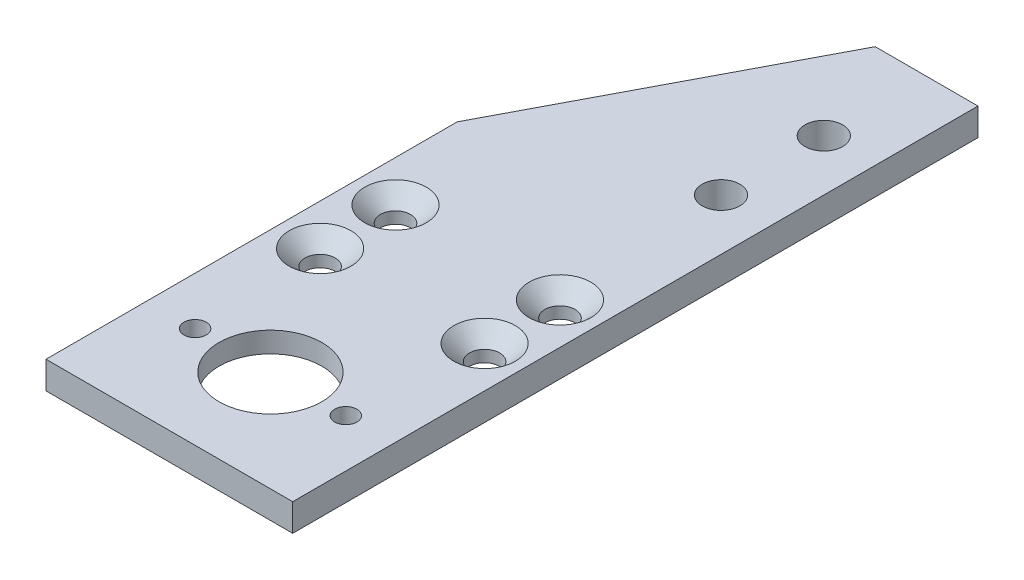
ISO-10303-21;
HEADER;
FILE_DESCRIPTION(('STEP AP214'),'2;1');
FILE_NAME('part.step','',(''),(''),'','','');
FILE_SCHEMA(('AUTOMOTIVE_DESIGN { 1 0 10303 214 1 1 1 1 }'));
ENDSEC;
DATA;
#1=APPLICATION_CONTEXT('core data for automotive mechanical design processes');
#2=APPLICATION_PROTOCOL_DEFINITION('international standard','automotive_design',2000,#1);
#3=PRODUCT_CONTEXT('',#1,'mechanical');
#4=PRODUCT('Part','Part','',(#3));
#5=PRODUCT_RELATED_PRODUCT_CATEGORY('part','',(#4));
#6=PRODUCT_DEFINITION_FORMATION('','',#4);
#7=PRODUCT_DEFINITION_CONTEXT('part definition',#1,'design');
#8=PRODUCT_DEFINITION('design','',#6,#7);
#9=PRODUCT_DEFINITION_SHAPE('','',#8);
#10=(LENGTH_UNIT() NAMED_UNIT(*) SI_UNIT(.MILLI.,.METRE.));
#11=(NAMED_UNIT(*) PLANE_ANGLE_UNIT() SI_UNIT($,.RADIAN.));
#12=(NAMED_UNIT(*) SI_UNIT($,.STERADIAN.) SOLID_ANGLE_UNIT());
#13=UNCERTAINTY_MEASURE_WITH_UNIT(LENGTH_MEASURE(1.E-05),#10,'distance_accuracy_value','');
#14=(GEOMETRIC_REPRESENTATION_CONTEXT(3) GLOBAL_UNCERTAINTY_ASSIGNED_CONTEXT((#13)) GLOBAL_UNIT_ASSIGNED_CONTEXT((#10,
#11,#12)) REPRESENTATION_CONTEXT('',''));
#15=CARTESIAN_POINT('',(0.,0.,0.));
#16=DIRECTION('',(0.,0.,1.));
#17=DIRECTION('',(1.,0.,0.));
#18=AXIS2_PLACEMENT_3D('',#15,#16,#17);
#19=CARTESIAN_POINT('',(-11.,-4.,85.25));
#20=DIRECTION('',(0.,1.,0.));
#21=DIRECTION('',(0.,0.,-1.));
#22=AXIS2_PLACEMENT_3D('',#19,#20,#21);
#23=CYLINDRICAL_SURFACE('',#22,1.625);
#24=CARTESIAN_POINT('',(-11.,0.,85.25));
#25=DIRECTION('',(0.,-1.,0.));
#26=DIRECTION('',(0.,0.,-1.));
#27=AXIS2_PLACEMENT_3D('',#24,#25,#26);
#28=CIRCLE('',#27,1.625);
#29=CARTESIAN_POINT('',(-11.,0.,83.625));
#30=VERTEX_POINT('',#29);
#31=EDGE_CURVE('E174',#30,#30,#28,.T.);
#32=ORIENTED_EDGE('',*,*,#31,.F.);
#33=EDGE_LOOP('',(#32));
#34=FACE_BOUND('',#33,.T.);
#35=CARTESIAN_POINT('',(-11.,-3.,85.25));
#36=DIRECTION('',(0.,1.,0.));
#37=DIRECTION('',(0.,0.,1.));
#38=AXIS2_PLACEMENT_3D('',#35,#36,#37);
#39=CIRCLE('',#38,1.625);
#40=CARTESIAN_POINT('',(-11.,-3.,83.625));
#41=VERTEX_POINT('',#40);
#42=CARTESIAN_POINT('',(-11.,-3.,86.875));
#43=VERTEX_POINT('',#42);
#44=EDGE_CURVE('E335',#41,#43,#39,.F.);
#45=ORIENTED_EDGE('',*,*,#44,.T.);
#46=DIRECTION('',(0.,-1.,0.));
#47=VECTOR('',#46,1.);
#48=CARTESIAN_POINT('',(-11.,22.458299236202,86.875));
#49=LINE('',#48,#47);
#50=CARTESIAN_POINT('',(-11.,-4.,86.875));
#51=VERTEX_POINT('',#50);
#52=EDGE_CURVE('E371',#43,#51,#49,.T.);
#53=ORIENTED_EDGE('',*,*,#52,.T.);
#54=CARTESIAN_POINT('',(-11.,-4.,85.25));
#55=DIRECTION('',(0.,-1.,0.));
#56=DIRECTION('',(0.,0.,-1.));
#57=AXIS2_PLACEMENT_3D('',#54,#55,#56);
#58=CIRCLE('',#57,1.625);
#59=CARTESIAN_POINT('',(-11.,-4.,83.625));
#60=VERTEX_POINT('',#59);
#61=EDGE_CURVE('E181',#51,#60,#58,.T.);
#62=ORIENTED_EDGE('',*,*,#61,.T.);
#63=DIRECTION('',(0.,-1.,0.));
#64=VECTOR('',#63,1.);
#65=CARTESIAN_POINT('',(-11.,22.458299236202,83.625));
#66=LINE('',#65,#64);
#67=EDGE_CURVE('E158',#41,#60,#66,.T.);
#68=ORIENTED_EDGE('',*,*,#67,.F.);
#69=EDGE_LOOP('',(#45,#53,#62,#68));
#70=FACE_BOUND('',#69,.T.);
#71=ADVANCED_FACE('F17',(#34,#70),#23,.F.);
#72=CARTESIAN_POINT('',(0.,-3.,85.25));
#73=DIRECTION('',(0.,-1.,0.));
#74=DIRECTION('',(0.,0.,1.));
#75=AXIS2_PLACEMENT_3D('',#72,#73,#74);
#76=CYLINDRICAL_SURFACE('',#75,9.);
#77=CARTESIAN_POINT('',(0.,-4.,85.25));
#78=DIRECTION('',(0.,1.,0.));
#79=DIRECTION('',(0.,0.,1.));
#80=AXIS2_PLACEMENT_3D('',#77,#78,#79);
#81=CIRCLE('',#80,9.);
#82=CARTESIAN_POINT('',(-8.8520830881776,-4.,86.875));
#83=VERTEX_POINT('',#82);
#84=CARTESIAN_POINT('',(8.8520830881776,-4.,86.875));
#85=VERTEX_POINT('',#84);
#86=EDGE_CURVE('E187',#83,#85,#81,.T.);
#87=ORIENTED_EDGE('',*,*,#86,.F.);
#88=DIRECTION('',(0.,-1.,0.));
#89=VECTOR('',#88,1.);
#90=CARTESIAN_POINT('',(-8.8520830881776,-3.,86.875));
#91=LINE('',#90,#89);
#92=CARTESIAN_POINT('',(-8.8520830881776,-3.,86.875));
#93=VERTEX_POINT('',#92);
#94=EDGE_CURVE('E26',#93,#83,#91,.T.);
#95=ORIENTED_EDGE('',*,*,#94,.F.);
#96=CARTESIAN_POINT('',(0.,-3.,85.25));
#97=DIRECTION('',(0.,1.,0.));
#98=DIRECTION('',(0.,0.,1.));
#99=AXIS2_PLACEMENT_3D('',#96,#97,#98);
#100=CIRCLE('',#99,9.);
#101=CARTESIAN_POINT('',(8.8520830881776,-3.,86.875));
#102=VERTEX_POINT('',#101);
#103=EDGE_CURVE('E339',#93,#102,#100,.T.);
#104=ORIENTED_EDGE('',*,*,#103,.T.);
#105=DIRECTION('',(0.,-1.,0.));
#106=VECTOR('',#105,1.);
#107=CARTESIAN_POINT('',(8.8520830881776,-3.,86.875));
#108=LINE('',#107,#106);
#109=EDGE_CURVE('E11',#85,#102,#108,.F.);
#110=ORIENTED_EDGE('',*,*,#109,.F.);
#111=EDGE_LOOP('',(#87,#95,#104,#110));
#112=FACE_BOUND('',#111,.T.);
#113=ADVANCED_FACE('F332',(#112),#76,.F.);
#114=CARTESIAN_POINT('',(0.,-4.,85.25));
#115=DIRECTION('',(0.,1.,0.));
#116=DIRECTION('',(0.,0.,-1.));
#117=AXIS2_PLACEMENT_3D('',#114,#115,#116);
#118=CYLINDRICAL_SURFACE('',#117,7.5);
#119=CARTESIAN_POINT('',(0.,0.,85.25));
#120=DIRECTION('',(0.,-1.,0.));
#121=DIRECTION('',(0.,0.,-1.));
#122=AXIS2_PLACEMENT_3D('',#119,#120,#121);
#123=CIRCLE('',#122,7.5);
#124=CARTESIAN_POINT('',(0.,0.,77.75));
#125=VERTEX_POINT('',#124);
#126=EDGE_CURVE('E241',#125,#125,#123,.T.);
#127=ORIENTED_EDGE('',*,*,#126,.F.);
#128=EDGE_LOOP('',(#127));
#129=FACE_BOUND('',#128,.T.);
#130=CARTESIAN_POINT('',(0.,-3.,85.25));
#131=DIRECTION('',(0.,1.,0.));
#132=DIRECTION('',(0.,0.,1.));
#133=AXIS2_PLACEMENT_3D('',#130,#131,#132);
#134=CIRCLE('',#133,7.5);
#135=CARTESIAN_POINT('',(0.,-3.,92.75));
#136=VERTEX_POINT('',#135);
#137=EDGE_CURVE('E184',#136,#136,#134,.F.);
#138=ORIENTED_EDGE('',*,*,#137,.T.);
#139=EDGE_LOOP('',(#138));
#140=FACE_BOUND('',#139,.T.);
#141=ADVANCED_FACE('F401',(#129,#140),#118,.F.);
#142=CARTESIAN_POINT('',(-18.,0.,0.));
#143=DIRECTION('',(0.,1.,0.));
#144=DIRECTION('',(0.,0.,-1.));
#145=AXIS2_PLACEMENT_3D('',#142,#143,#144);
#146=PLANE('',#145);
#147=CARTESIAN_POINT('',(11.,0.,85.25));
#148=DIRECTION('',(0.,-1.,0.));
#149=DIRECTION('',(0.,0.,-1.));
#150=AXIS2_PLACEMENT_3D('',#147,#148,#149);
#151=CIRCLE('',#150,1.625);
#152=CARTESIAN_POINT('',(11.,0.,83.625));
#153=VERTEX_POINT('',#152);
#154=EDGE_CURVE('E175',#153,#153,#151,.T.);
#155=ORIENTED_EDGE('',*,*,#154,.T.);
#156=EDGE_LOOP('',(#155));
#157=FACE_BOUND('',#156,.T.);
#158=ORIENTED_EDGE('',*,*,#31,.T.);
#159=EDGE_LOOP('',(#158));
#160=FACE_BOUND('',#159,.T.);
#161=CARTESIAN_POINT('',(12.,0.,55.));
#162=DIRECTION('',(0.,-1.,0.));
#163=DIRECTION('',(0.,0.,-1.));
#164=AXIS2_PLACEMENT_3D('',#161,#162,#163);
#165=CIRCLE('',#164,4.5);
#166=CARTESIAN_POINT('',(12.,0.,50.5));
#167=VERTEX_POINT('',#166);
#168=EDGE_CURVE('E198',#167,#167,#165,.T.);
#169=ORIENTED_EDGE('',*,*,#168,.T.);
#170=EDGE_LOOP('',(#169));
#171=FACE_BOUND('',#170,.T.);
#172=CARTESIAN_POINT('',(-12.,0.,66.));
#173=DIRECTION('',(0.,-1.,0.));
#174=DIRECTION('',(0.,0.,-1.));
#175=AXIS2_PLACEMENT_3D('',#172,#173,#174);
#176=CIRCLE('',#175,4.5);
#177=CARTESIAN_POINT('',(-12.,0.,61.5));
#178=VERTEX_POINT('',#177);
#179=EDGE_CURVE('E208',#178,#178,#176,.T.);
#180=ORIENTED_EDGE('',*,*,#179,.T.);
#181=EDGE_LOOP('',(#180));
#182=FACE_BOUND('',#181,.T.);
#183=CARTESIAN_POINT('',(10.5,0.,30.));
#184=DIRECTION('',(0.,1.,0.));
#185=DIRECTION('',(0.,0.,1.));
#186=AXIS2_PLACEMENT_3D('',#183,#184,#185);
#187=CIRCLE('',#186,2.75);
#188=CARTESIAN_POINT('',(10.5,0.,32.75));
#189=VERTEX_POINT('',#188);
#190=EDGE_CURVE('E213',#189,#189,#187,.T.);
#191=ORIENTED_EDGE('',*,*,#190,.F.);
#192=EDGE_LOOP('',(#191));
#193=FACE_BOUND('',#192,.T.);
#194=CARTESIAN_POINT('',(10.5,0.,15.));
#195=DIRECTION('',(0.,1.,0.));
#196=DIRECTION('',(0.,0.,1.));
#197=AXIS2_PLACEMENT_3D('',#194,#195,#196);
#198=CIRCLE('',#197,2.75);
#199=CARTESIAN_POINT('',(10.5,0.,17.75));
#200=VERTEX_POINT('',#199);
#201=EDGE_CURVE('E222',#200,#200,#198,.T.);
#202=ORIENTED_EDGE('',*,*,#201,.F.);
#203=EDGE_LOOP('',(#202));
#204=FACE_BOUND('',#203,.T.);
#205=DIRECTION('',(0.46483389898992,0.,-0.885397902837944));
#206=VECTOR('',#205,1.);
#207=CARTESIAN_POINT('',(-18.,0.,40.));
#208=LINE('',#207,#206);
#209=CARTESIAN_POINT('',(-18.,0.,40.));
#210=VERTEX_POINT('',#209);
#211=CARTESIAN_POINT('',(3.,0.,0.));
#212=VERTEX_POINT('',#211);
#213=EDGE_CURVE('E230',#210,#212,#208,.T.);
#214=ORIENTED_EDGE('',*,*,#213,.F.);
#215=DIRECTION('',(0.,0.,-1.));
#216=VECTOR('',#215,1.);
#217=CARTESIAN_POINT('',(-18.,0.,0.));
#218=LINE('',#217,#216);
#219=CARTESIAN_POINT('',(-18.,0.,100.));
#220=VERTEX_POINT('',#219);
#221=EDGE_CURVE('E283',#220,#210,#218,.T.);
#222=ORIENTED_EDGE('',*,*,#221,.F.);
#223=DIRECTION('',(1.,0.,0.));
#224=VECTOR('',#223,1.);
#225=CARTESIAN_POINT('',(-18.,0.,100.));
#226=LINE('',#225,#224);
#227=CARTESIAN_POINT('',(18.,0.,100.));
#228=VERTEX_POINT('',#227);
#229=EDGE_CURVE('E292',#220,#228,#226,.T.);
#230=ORIENTED_EDGE('',*,*,#229,.T.);
#231=DIRECTION('',(0.,0.,-1.));
#232=VECTOR('',#231,1.);
#233=CARTESIAN_POINT('',(18.,0.,0.));
#234=LINE('',#233,#232);
#235=CARTESIAN_POINT('',(18.,0.,0.));
#236=VERTEX_POINT('',#235);
#237=EDGE_CURVE('E273',#228,#236,#234,.T.);
#238=ORIENTED_EDGE('',*,*,#237,.T.);
#239=DIRECTION('',(1.,0.,0.));
#240=VECTOR('',#239,1.);
#241=CARTESIAN_POINT('',(-18.,0.,0.));
#242=LINE('',#241,#240);
#243=EDGE_CURVE('E288',#212,#236,#242,.T.);
#244=ORIENTED_EDGE('',*,*,#243,.F.);
#245=EDGE_LOOP('',(#214,#222,#230,#238,#244));
#246=FACE_BOUND('',#245,.T.);
#247=ORIENTED_EDGE('',*,*,#126,.T.);
#248=EDGE_LOOP('',(#247));
#249=FACE_BOUND('',#248,.T.);
#250=CARTESIAN_POINT('',(12.,0.,66.));
#251=DIRECTION('',(0.,-1.,0.));
#252=DIRECTION('',(0.,0.,-1.));
#253=AXIS2_PLACEMENT_3D('',#250,#251,#252);
#254=CIRCLE('',#253,4.5);
#255=CARTESIAN_POINT('',(12.,0.,61.5));
#256=VERTEX_POINT('',#255);
#257=EDGE_CURVE('E203',#256,#256,#254,.T.);
#258=ORIENTED_EDGE('',*,*,#257,.T.);
#259=EDGE_LOOP('',(#258));
#260=FACE_BOUND('',#259,.T.);
#261=CARTESIAN_POINT('',(-12.,0.,55.));
#262=DIRECTION('',(0.,-1.,0.));
#263=DIRECTION('',(0.,0.,-1.));
#264=AXIS2_PLACEMENT_3D('',#261,#262,#263);
#265=CIRCLE('',#264,4.5);
#266=CARTESIAN_POINT('',(-12.,0.,50.5));
#267=VERTEX_POINT('',#266);
#268=EDGE_CURVE('E192',#267,#267,#265,.T.);
#269=ORIENTED_EDGE('',*,*,#268,.T.);
#270=EDGE_LOOP('',(#269));
#271=FACE_BOUND('',#270,.T.);
#272=ADVANCED_FACE('F437',(#157,#160,#171,#182,#193,#204,#246,#249,#260,#271),#146,.T.);
#273=CARTESIAN_POINT('',(-12.,0.,55.));
#274=DIRECTION('',(0.,-1.,0.));
#275=DIRECTION('',(0.,0.,1.));
#276=AXIS2_PLACEMENT_3D('',#273,#274,#275);
#277=CYLINDRICAL_SURFACE('',#276,2.2);
#278=CARTESIAN_POINT('',(-12.,-4.,55.));
#279=DIRECTION('',(0.,1.,0.));
#280=DIRECTION('',(0.,0.,-1.));
#281=AXIS2_PLACEMENT_3D('',#278,#279,#280);
#282=CIRCLE('',#281,2.2);
#283=CARTESIAN_POINT('',(-12.,-4.,52.8));
#284=VERTEX_POINT('',#283);
#285=EDGE_CURVE('E247',#284,#284,#282,.T.);
#286=ORIENTED_EDGE('',*,*,#285,.F.);
#287=EDGE_LOOP('',(#286));
#288=FACE_BOUND('',#287,.T.);
#289=CARTESIAN_POINT('',(-12.,-2.3,55.));
#290=DIRECTION('',(0.,-1.,0.));
#291=DIRECTION('',(0.,0.,-1.));
#292=AXIS2_PLACEMENT_3D('',#289,#290,#291);
#293=CIRCLE('',#292,2.2);
#294=CARTESIAN_POINT('',(-12.,-2.3,52.8));
#295=VERTEX_POINT('',#294);
#296=EDGE_CURVE('E197',#295,#295,#293,.F.);
#297=ORIENTED_EDGE('',*,*,#296,.T.);
#298=EDGE_LOOP('',(#297));
#299=FACE_BOUND('',#298,.T.);
#300=ADVANCED_FACE('F439',(#288,#299),#277,.F.);
#301=CARTESIAN_POINT('',(12.,0.,55.));
#302=DIRECTION('',(0.,-1.,0.));
#303=DIRECTION('',(0.,0.,1.));
#304=AXIS2_PLACEMENT_3D('',#301,#302,#303);
#305=CYLINDRICAL_SURFACE('',#304,2.2);
#306=CARTESIAN_POINT('',(12.,-4.,55.));
#307=DIRECTION('',(0.,1.,0.));
#308=DIRECTION('',(0.,0.,1.));
#309=AXIS2_PLACEMENT_3D('',#306,#307,#308);
#310=CIRCLE('',#309,2.2);
#311=CARTESIAN_POINT('',(12.,-4.,57.2));
#312=VERTEX_POINT('',#311);
#313=EDGE_CURVE('E259',#312,#312,#310,.T.);
#314=ORIENTED_EDGE('',*,*,#313,.F.);
#315=EDGE_LOOP('',(#314));
#316=FACE_BOUND('',#315,.T.);
#317=CARTESIAN_POINT('',(12.,-2.3,55.));
#318=DIRECTION('',(0.,-1.,0.));
#319=DIRECTION('',(0.,0.,-1.));
#320=AXIS2_PLACEMENT_3D('',#317,#318,#319);
#321=CIRCLE('',#320,2.2);
#322=CARTESIAN_POINT('',(12.,-2.3,52.8));
#323=VERTEX_POINT('',#322);
#324=EDGE_CURVE('E202',#323,#323,#321,.F.);
#325=ORIENTED_EDGE('',*,*,#324,.T.);
#326=EDGE_LOOP('',(#325));
#327=FACE_BOUND('',#326,.T.);
#328=ADVANCED_FACE('F442',(#316,#327),#305,.F.);
#329=CARTESIAN_POINT('',(12.,0.,66.));
#330=DIRECTION('',(0.,-1.,0.));
#331=DIRECTION('',(0.,0.,1.));
#332=AXIS2_PLACEMENT_3D('',#329,#330,#331);
#333=CYLINDRICAL_SURFACE('',#332,2.2);
#334=CARTESIAN_POINT('',(12.,-4.,66.));
#335=DIRECTION('',(0.,1.,0.));
#336=DIRECTION('',(0.,0.,1.));
#337=AXIS2_PLACEMENT_3D('',#334,#335,#336);
#338=CIRCLE('',#337,2.2);
#339=CARTESIAN_POINT('',(12.,-4.,68.2));
#340=VERTEX_POINT('',#339);
#341=EDGE_CURVE('E255',#340,#340,#338,.T.);
#342=ORIENTED_EDGE('',*,*,#341,.F.);
#343=EDGE_LOOP('',(#342));
#344=FACE_BOUND('',#343,.T.);
#345=CARTESIAN_POINT('',(12.,-2.3,66.));
#346=DIRECTION('',(0.,-1.,0.));
#347=DIRECTION('',(0.,0.,-1.));
#348=AXIS2_PLACEMENT_3D('',#345,#346,#347);
#349=CIRCLE('',#348,2.2);
#350=CARTESIAN_POINT('',(12.,-2.3,63.8));
#351=VERTEX_POINT('',#350);
#352=EDGE_CURVE('E207',#351,#351,#349,.F.);
#353=ORIENTED_EDGE('',*,*,#352,.T.);
#354=EDGE_LOOP('',(#353));
#355=FACE_BOUND('',#354,.T.);
#356=ADVANCED_FACE('F447',(#344,#355),#333,.F.);
#357=CARTESIAN_POINT('',(-12.,0.,66.));
#358=DIRECTION('',(0.,-1.,0.));
#359=DIRECTION('',(0.,0.,1.));
#360=AXIS2_PLACEMENT_3D('',#357,#358,#359);
#361=CYLINDRICAL_SURFACE('',#360,2.2);
#362=CARTESIAN_POINT('',(-12.,-4.,66.));
#363=DIRECTION('',(0.,1.,0.));
#364=DIRECTION('',(0.,0.,-1.));
#365=AXIS2_PLACEMENT_3D('',#362,#363,#364);
#366=CIRCLE('',#365,2.2);
#367=CARTESIAN_POINT('',(-12.,-4.,63.8));
#368=VERTEX_POINT('',#367);
#369=EDGE_CURVE('E251',#368,#368,#366,.T.);
#370=ORIENTED_EDGE('',*,*,#369,.F.);
#371=EDGE_LOOP('',(#370));
#372=FACE_BOUND('',#371,.T.);
#373=CARTESIAN_POINT('',(-12.,-2.3,66.));
#374=DIRECTION('',(0.,-1.,0.));
#375=DIRECTION('',(0.,0.,-1.));
#376=AXIS2_PLACEMENT_3D('',#373,#374,#375);
#377=CIRCLE('',#376,2.2);
#378=CARTESIAN_POINT('',(-12.,-2.3,63.8));
#379=VERTEX_POINT('',#378);
#380=EDGE_CURVE('E212',#379,#379,#377,.F.);
#381=ORIENTED_EDGE('',*,*,#380,.T.);
#382=EDGE_LOOP('',(#381));
#383=FACE_BOUND('',#382,.T.);
#384=ADVANCED_FACE('F444',(#372,#383),#361,.F.);
#385=CARTESIAN_POINT('',(-18.,-4.,0.));
#386=DIRECTION('',(0.,0.,-1.));
#387=DIRECTION('',(1.,0.,0.));
#388=AXIS2_PLACEMENT_3D('',#385,#386,#387);
#389=PLANE('',#388);
#390=DIRECTION('',(0.,-1.,0.));
#391=VECTOR('',#390,1.);
#392=CARTESIAN_POINT('',(3.,0.,0.));
#393=LINE('',#392,#391);
#394=CARTESIAN_POINT('',(3.,-4.,0.));
#395=VERTEX_POINT('',#394);
#396=EDGE_CURVE('E237',#212,#395,#393,.T.);
#397=ORIENTED_EDGE('',*,*,#396,.F.);
#398=ORIENTED_EDGE('',*,*,#243,.T.);
#399=DIRECTION('',(0.,-1.,0.));
#400=VECTOR('',#399,1.);
#401=CARTESIAN_POINT('',(18.,-4.,0.));
#402=LINE('',#401,#400);
#403=CARTESIAN_POINT('',(18.,-4.,0.));
#404=VERTEX_POINT('',#403);
#405=EDGE_CURVE('E263',#236,#404,#402,.T.);
#406=ORIENTED_EDGE('',*,*,#405,.T.);
#407=DIRECTION('',(1.,0.,0.));
#408=VECTOR('',#407,1.);
#409=CARTESIAN_POINT('',(-18.,-4.,0.));
#410=LINE('',#409,#408);
#411=EDGE_CURVE('E287',#395,#404,#410,.T.);
#412=ORIENTED_EDGE('',*,*,#411,.F.);
#413=EDGE_LOOP('',(#397,#398,#406,#412));
#414=FACE_BOUND('',#413,.T.);
#415=ADVANCED_FACE('F19',(#414),#389,.T.);
#416=CARTESIAN_POINT('',(-18.,0.,100.));
#417=DIRECTION('',(0.,0.,1.));
#418=DIRECTION('',(-1.,0.,0.));
#419=AXIS2_PLACEMENT_3D('',#416,#417,#418);
#420=PLANE('',#419);
#421=ORIENTED_EDGE('',*,*,#229,.F.);
#422=DIRECTION('',(0.,1.,0.));
#423=VECTOR('',#422,1.);
#424=CARTESIAN_POINT('',(-18.,0.,100.));
#425=LINE('',#424,#423);
#426=CARTESIAN_POINT('',(-18.,-4.,100.));
#427=VERTEX_POINT('',#426);
#428=EDGE_CURVE('E280',#427,#220,#425,.T.);
#429=ORIENTED_EDGE('',*,*,#428,.F.);
#430=DIRECTION('',(1.,0.,0.));
#431=VECTOR('',#430,1.);
#432=CARTESIAN_POINT('',(-18.,-4.,100.));
#433=LINE('',#432,#431);
#434=CARTESIAN_POINT('',(18.,-4.,100.));
#435=VERTEX_POINT('',#434);
#436=EDGE_CURVE('E296',#427,#435,#433,.T.);
#437=ORIENTED_EDGE('',*,*,#436,.T.);
#438=DIRECTION('',(0.,1.,0.));
#439=VECTOR('',#438,1.);
#440=CARTESIAN_POINT('',(18.,0.,100.));
#441=LINE('',#440,#439);
#442=EDGE_CURVE('E270',#435,#228,#441,.T.);
#443=ORIENTED_EDGE('',*,*,#442,.T.);
#444=EDGE_LOOP('',(#421,#429,#437,#443));
#445=FACE_BOUND('',#444,.T.);
#446=ADVANCED_FACE('F465',(#445),#420,.T.);
#447=CARTESIAN_POINT('',(-18.,-4.,100.));
#448=DIRECTION('',(0.,-1.,0.));
#449=DIRECTION('',(0.,0.,1.));
#450=AXIS2_PLACEMENT_3D('',#447,#448,#449);
#451=PLANE('',#450);
#452=DIRECTION('',(1.,0.,0.));
#453=VECTOR('',#452,1.);
#454=CARTESIAN_POINT('',(11.,-4.,86.875));
#455=LINE('',#454,#453);
#456=EDGE_CURVE('E159',#51,#83,#455,.T.);
#457=ORIENTED_EDGE('',*,*,#456,.T.);
#458=ORIENTED_EDGE('',*,*,#86,.T.);
#459=CARTESIAN_POINT('',(11.,-4.,86.875));
#460=VERTEX_POINT('',#459);
#461=EDGE_CURVE('E167',#85,#460,#455,.T.);
#462=ORIENTED_EDGE('',*,*,#461,.T.);
#463=CARTESIAN_POINT('',(11.,-4.,85.25));
#464=DIRECTION('',(0.,-1.,0.));
#465=DIRECTION('',(0.,0.,-1.));
#466=AXIS2_PLACEMENT_3D('',#463,#464,#465);
#467=CIRCLE('',#466,1.625);
#468=CARTESIAN_POINT('',(11.,-4.,83.625));
#469=VERTEX_POINT('',#468);
#470=EDGE_CURVE('E152',#469,#460,#467,.T.);
#471=ORIENTED_EDGE('',*,*,#470,.F.);
#472=DIRECTION('',(-1.,0.,0.));
#473=VECTOR('',#472,1.);
#474=CARTESIAN_POINT('',(11.,-4.,83.625));
#475=LINE('',#474,#473);
#476=CARTESIAN_POINT('',(8.8520830881776,-4.,83.625));
#477=VERTEX_POINT('',#476);
#478=EDGE_CURVE('E162',#469,#477,#475,.T.);
#479=ORIENTED_EDGE('',*,*,#478,.T.);
#480=CARTESIAN_POINT('',(-8.85208308817761,-4.,83.625));
#481=VERTEX_POINT('',#480);
#482=EDGE_CURVE('E334',#477,#481,#81,.T.);
#483=ORIENTED_EDGE('',*,*,#482,.T.);
#484=EDGE_CURVE('E168',#481,#60,#475,.T.);
#485=ORIENTED_EDGE('',*,*,#484,.T.);
#486=ORIENTED_EDGE('',*,*,#61,.F.);
#487=EDGE_LOOP('',(#457,#458,#462,#471,#479,#483,#485,#486));
#488=FACE_BOUND('',#487,.T.);
#489=CARTESIAN_POINT('',(10.5,-4.,30.));
#490=DIRECTION('',(0.,1.,0.));
#491=DIRECTION('',(0.,0.,1.));
#492=AXIS2_PLACEMENT_3D('',#489,#490,#491);
#493=CIRCLE('',#492,2.75);
#494=CARTESIAN_POINT('',(10.5,-4.,32.75));
#495=VERTEX_POINT('',#494);
#496=EDGE_CURVE('E218',#495,#495,#493,.T.);
#497=ORIENTED_EDGE('',*,*,#496,.T.);
#498=EDGE_LOOP('',(#497));
#499=FACE_BOUND('',#498,.T.);
#500=CARTESIAN_POINT('',(10.5,-4.,15.));
#501=DIRECTION('',(0.,1.,0.));
#502=DIRECTION('',(0.,0.,1.));
#503=AXIS2_PLACEMENT_3D('',#500,#501,#502);
#504=CIRCLE('',#503,2.75);
#505=CARTESIAN_POINT('',(10.5,-4.,17.75));
#506=VERTEX_POINT('',#505);
#507=EDGE_CURVE('E217',#506,#506,#504,.T.);
#508=ORIENTED_EDGE('',*,*,#507,.T.);
#509=EDGE_LOOP('',(#508));
#510=FACE_BOUND('',#509,.T.);
#511=DIRECTION('',(0.46483389898992,0.,-0.885397902837944));
#512=VECTOR('',#511,1.);
#513=CARTESIAN_POINT('',(-18.,-4.,40.));
#514=LINE('',#513,#512);
#515=CARTESIAN_POINT('',(-18.,-4.,40.));
#516=VERTEX_POINT('',#515);
#517=EDGE_CURVE('E226',#516,#395,#514,.T.);
#518=ORIENTED_EDGE('',*,*,#517,.T.);
#519=ORIENTED_EDGE('',*,*,#411,.T.);
#520=DIRECTION('',(0.,0.,1.));
#521=VECTOR('',#520,1.);
#522=CARTESIAN_POINT('',(18.,-4.,100.));
#523=LINE('',#522,#521);
#524=EDGE_CURVE('E267',#404,#435,#523,.T.);
#525=ORIENTED_EDGE('',*,*,#524,.T.);
#526=ORIENTED_EDGE('',*,*,#436,.F.);
#527=DIRECTION('',(0.,0.,1.));
#528=VECTOR('',#527,1.);
#529=CARTESIAN_POINT('',(-18.,-4.,100.));
#530=LINE('',#529,#528);
#531=EDGE_CURVE('E277',#516,#427,#530,.T.);
#532=ORIENTED_EDGE('',*,*,#531,.F.);
#533=EDGE_LOOP('',(#518,#519,#525,#526,#532));
#534=FACE_BOUND('',#533,.T.);
#535=ORIENTED_EDGE('',*,*,#285,.T.);
#536=EDGE_LOOP('',(#535));
#537=FACE_BOUND('',#536,.T.);
#538=ORIENTED_EDGE('',*,*,#369,.T.);
#539=EDGE_LOOP('',(#538));
#540=FACE_BOUND('',#539,.T.);
#541=ORIENTED_EDGE('',*,*,#341,.T.);
#542=EDGE_LOOP('',(#541));
#543=FACE_BOUND('',#542,.T.);
#544=ORIENTED_EDGE('',*,*,#313,.T.);
#545=EDGE_LOOP('',(#544));
#546=FACE_BOUND('',#545,.T.);
#547=ADVANCED_FACE('F170',(#488,#499,#510,#534,#537,#540,#543,#546),#451,.T.);
#548=CARTESIAN_POINT('',(-18.,0.,0.));
#549=DIRECTION('',(-1.,0.,0.));
#550=DIRECTION('',(0.,0.,-1.));
#551=AXIS2_PLACEMENT_3D('',#548,#549,#550);
#552=PLANE('',#551);
#553=DIRECTION('',(0.,-1.,0.));
#554=VECTOR('',#553,1.);
#555=CARTESIAN_POINT('',(-18.,0.,40.));
#556=LINE('',#555,#554);
#557=EDGE_CURVE('E234',#210,#516,#556,.T.);
#558=ORIENTED_EDGE('',*,*,#557,.T.);
#559=ORIENTED_EDGE('',*,*,#531,.T.);
#560=ORIENTED_EDGE('',*,*,#428,.T.);
#561=ORIENTED_EDGE('',*,*,#221,.T.);
#562=EDGE_LOOP('',(#558,#559,#560,#561));
#563=FACE_BOUND('',#562,.T.);
#564=ADVANCED_FACE('F457',(#563),#552,.T.);
#565=CARTESIAN_POINT('',(18.,0.,0.));
#566=DIRECTION('',(-1.,0.,0.));
#567=DIRECTION('',(0.,0.,-1.));
#568=AXIS2_PLACEMENT_3D('',#565,#566,#567);
#569=PLANE('',#568);
#570=ORIENTED_EDGE('',*,*,#405,.F.);
#571=ORIENTED_EDGE('',*,*,#237,.F.);
#572=ORIENTED_EDGE('',*,*,#442,.F.);
#573=ORIENTED_EDGE('',*,*,#524,.F.);
#574=EDGE_LOOP('',(#570,#571,#572,#573));
#575=FACE_BOUND('',#574,.T.);
#576=ADVANCED_FACE('F433',(#575),#569,.F.);
#577=CARTESIAN_POINT('',(-18.,0.,40.));
#578=DIRECTION('',(0.885397902837944,0.,0.46483389898992));
#579=DIRECTION('',(-0.46483389898992,0.,0.885397902837944));
#580=AXIS2_PLACEMENT_3D('',#577,#578,#579);
#581=PLANE('',#580);
#582=ORIENTED_EDGE('',*,*,#517,.F.);
#583=ORIENTED_EDGE('',*,*,#557,.F.);
#584=ORIENTED_EDGE('',*,*,#213,.T.);
#585=ORIENTED_EDGE('',*,*,#396,.T.);
#586=EDGE_LOOP('',(#582,#583,#584,#585));
#587=FACE_BOUND('',#586,.T.);
#588=ADVANCED_FACE('F429',(#587),#581,.F.);
#589=CARTESIAN_POINT('',(10.5,0.,15.));
#590=DIRECTION('',(0.,-1.,0.));
#591=DIRECTION('',(0.,0.,1.));
#592=AXIS2_PLACEMENT_3D('',#589,#590,#591);
#593=CYLINDRICAL_SURFACE('',#592,2.75);
#594=ORIENTED_EDGE('',*,*,#201,.T.);
#595=EDGE_LOOP('',(#594));
#596=FACE_BOUND('',#595,.T.);
#597=ORIENTED_EDGE('',*,*,#507,.F.);
#598=EDGE_LOOP('',(#597));
#599=FACE_BOUND('',#598,.T.);
#600=ADVANCED_FACE('F425',(#596,#599),#593,.F.);
#601=CARTESIAN_POINT('',(10.5,0.,30.));
#602=DIRECTION('',(0.,-1.,0.));
#603=DIRECTION('',(0.,0.,1.));
#604=AXIS2_PLACEMENT_3D('',#601,#602,#603);
#605=CYLINDRICAL_SURFACE('',#604,2.75);
#606=ORIENTED_EDGE('',*,*,#190,.T.);
#607=EDGE_LOOP('',(#606));
#608=FACE_BOUND('',#607,.T.);
#609=ORIENTED_EDGE('',*,*,#496,.F.);
#610=EDGE_LOOP('',(#609));
#611=FACE_BOUND('',#610,.T.);
#612=ADVANCED_FACE('F421',(#608,#611),#605,.F.);
#613=CARTESIAN_POINT('',(-12.,-4.5,66.));
#614=DIRECTION('',(0.,1.,0.));
#615=DIRECTION('',(0.,0.,-1.));
#616=AXIS2_PLACEMENT_3D('',#613,#614,#615);
#617=CONICAL_SURFACE('',#616,0.,0.785398163397448);
#618=ORIENTED_EDGE('',*,*,#179,.F.);
#619=EDGE_LOOP('',(#618));
#620=FACE_BOUND('',#619,.T.);
#621=ORIENTED_EDGE('',*,*,#380,.F.);
#622=EDGE_LOOP('',(#621));
#623=FACE_BOUND('',#622,.T.);
#624=ADVANCED_FACE('F417',(#620,#623),#617,.F.);
#625=CARTESIAN_POINT('',(12.,-4.5,66.));
#626=DIRECTION('',(0.,1.,0.));
#627=DIRECTION('',(0.,0.,-1.));
#628=AXIS2_PLACEMENT_3D('',#625,#626,#627);
#629=CONICAL_SURFACE('',#628,0.,0.785398163397448);
#630=ORIENTED_EDGE('',*,*,#257,.F.);
#631=EDGE_LOOP('',(#630));
#632=FACE_BOUND('',#631,.T.);
#633=ORIENTED_EDGE('',*,*,#352,.F.);
#634=EDGE_LOOP('',(#633));
#635=FACE_BOUND('',#634,.T.);
#636=ADVANCED_FACE('F413',(#632,#635),#629,.F.);
#637=CARTESIAN_POINT('',(12.,-4.5,55.));
#638=DIRECTION('',(0.,1.,0.));
#639=DIRECTION('',(0.,0.,-1.));
#640=AXIS2_PLACEMENT_3D('',#637,#638,#639);
#641=CONICAL_SURFACE('',#640,0.,0.785398163397448);
#642=ORIENTED_EDGE('',*,*,#168,.F.);
#643=EDGE_LOOP('',(#642));
#644=FACE_BOUND('',#643,.T.);
#645=ORIENTED_EDGE('',*,*,#324,.F.);
#646=EDGE_LOOP('',(#645));
#647=FACE_BOUND('',#646,.T.);
#648=ADVANCED_FACE('F409',(#644,#647),#641,.F.);
#649=CARTESIAN_POINT('',(-12.,-4.5,55.));
#650=DIRECTION('',(0.,1.,0.));
#651=DIRECTION('',(0.,0.,-1.));
#652=AXIS2_PLACEMENT_3D('',#649,#650,#651);
#653=CONICAL_SURFACE('',#652,0.,0.785398163397448);
#654=ORIENTED_EDGE('',*,*,#268,.F.);
#655=EDGE_LOOP('',(#654));
#656=FACE_BOUND('',#655,.T.);
#657=ORIENTED_EDGE('',*,*,#296,.F.);
#658=EDGE_LOOP('',(#657));
#659=FACE_BOUND('',#658,.T.);
#660=ADVANCED_FACE('F406',(#656,#659),#653,.F.);
#661=CARTESIAN_POINT('',(11.,-4.,85.25));
#662=DIRECTION('',(0.,1.,0.));
#663=DIRECTION('',(0.,0.,-1.));
#664=AXIS2_PLACEMENT_3D('',#661,#662,#663);
#665=CYLINDRICAL_SURFACE('',#664,1.625);
#666=DIRECTION('',(0.,-1.,0.));
#667=VECTOR('',#666,1.);
#668=CARTESIAN_POINT('',(11.,22.458299236202,83.625));
#669=LINE('',#668,#667);
#670=CARTESIAN_POINT('',(11.,-3.,83.625));
#671=VERTEX_POINT('',#670);
#672=EDGE_CURVE('E146',#671,#469,#669,.T.);
#673=ORIENTED_EDGE('',*,*,#672,.T.);
#674=ORIENTED_EDGE('',*,*,#470,.T.);
#675=DIRECTION('',(0.,-1.,0.));
#676=VECTOR('',#675,1.);
#677=CARTESIAN_POINT('',(11.,22.458299236202,86.875));
#678=LINE('',#677,#676);
#679=CARTESIAN_POINT('',(11.,-3.,86.875));
#680=VERTEX_POINT('',#679);
#681=EDGE_CURVE('E374',#680,#460,#678,.T.);
#682=ORIENTED_EDGE('',*,*,#681,.F.);
#683=CARTESIAN_POINT('',(11.,-3.,85.25));
#684=DIRECTION('',(0.,1.,0.));
#685=DIRECTION('',(0.,0.,1.));
#686=AXIS2_PLACEMENT_3D('',#683,#684,#685);
#687=CIRCLE('',#686,1.625);
#688=EDGE_CURVE('E155',#680,#671,#687,.F.);
#689=ORIENTED_EDGE('',*,*,#688,.T.);
#690=EDGE_LOOP('',(#673,#674,#682,#689));
#691=FACE_BOUND('',#690,.T.);
#692=ORIENTED_EDGE('',*,*,#154,.F.);
#693=EDGE_LOOP('',(#692));
#694=FACE_BOUND('',#693,.T.);
#695=ADVANCED_FACE('F148',(#691,#694),#665,.F.);
#696=CARTESIAN_POINT('',(0.,-3.,85.25));
#697=DIRECTION('',(0.,-1.,0.));
#698=DIRECTION('',(0.,0.,1.));
#699=AXIS2_PLACEMENT_3D('',#696,#697,#698);
#700=PLANE('',#699);
#701=ORIENTED_EDGE('',*,*,#137,.F.);
#702=EDGE_LOOP('',(#701));
#703=FACE_BOUND('',#702,.T.);
#704=DIRECTION('',(-1.,0.,0.));
#705=VECTOR('',#704,1.);
#706=CARTESIAN_POINT('',(11.,-3.,86.875));
#707=LINE('',#706,#705);
#708=EDGE_CURVE('E37',#93,#43,#707,.T.);
#709=ORIENTED_EDGE('',*,*,#708,.T.);
#710=ORIENTED_EDGE('',*,*,#44,.F.);
#711=DIRECTION('',(1.,0.,0.));
#712=VECTOR('',#711,1.);
#713=CARTESIAN_POINT('',(11.,-3.,83.625));
#714=LINE('',#713,#712);
#715=CARTESIAN_POINT('',(-8.85208308817761,-3.,83.625));
#716=VERTEX_POINT('',#715);
#717=EDGE_CURVE('E348',#41,#716,#714,.T.);
#718=ORIENTED_EDGE('',*,*,#717,.T.);
#719=CARTESIAN_POINT('',(8.85208308817761,-3.,83.625));
#720=VERTEX_POINT('',#719);
#721=EDGE_CURVE('E318',#720,#716,#100,.T.);
#722=ORIENTED_EDGE('',*,*,#721,.F.);
#723=EDGE_CURVE('E364',#720,#671,#714,.T.);
#724=ORIENTED_EDGE('',*,*,#723,.T.);
#725=ORIENTED_EDGE('',*,*,#688,.F.);
#726=EDGE_CURVE('E367',#680,#102,#707,.T.);
#727=ORIENTED_EDGE('',*,*,#726,.T.);
#728=ORIENTED_EDGE('',*,*,#103,.F.);
#729=EDGE_LOOP('',(#709,#710,#718,#722,#724,#725,#727,#728));
#730=FACE_BOUND('',#729,.T.);
#731=ADVANCED_FACE('F360',(#703,#730),#700,.T.);
#732=ORIENTED_EDGE('',*,*,#482,.F.);
#733=DIRECTION('',(0.,-1.,0.));
#734=VECTOR('',#733,1.);
#735=CARTESIAN_POINT('',(8.85208308817761,-3.,83.625));
#736=LINE('',#735,#734);
#737=EDGE_CURVE('E47',#720,#477,#736,.T.);
#738=ORIENTED_EDGE('',*,*,#737,.F.);
#739=ORIENTED_EDGE('',*,*,#721,.T.);
#740=DIRECTION('',(0.,-1.,0.));
#741=VECTOR('',#740,1.);
#742=CARTESIAN_POINT('',(-8.85208308817761,-3.,83.625));
#743=LINE('',#742,#741);
#744=EDGE_CURVE('E321',#481,#716,#743,.F.);
#745=ORIENTED_EDGE('',*,*,#744,.F.);
#746=EDGE_LOOP('',(#732,#738,#739,#745));
#747=FACE_BOUND('',#746,.T.);
#748=ADVANCED_FACE('F357',(#747),#76,.F.);
#749=CARTESIAN_POINT('',(11.,22.458299236202,83.625));
#750=DIRECTION('',(0.,0.,-1.));
#751=DIRECTION('',(1.,0.,0.));
#752=AXIS2_PLACEMENT_3D('',#749,#750,#751);
#753=PLANE('',#752);
#754=ORIENTED_EDGE('',*,*,#723,.F.);
#755=ORIENTED_EDGE('',*,*,#737,.T.);
#756=ORIENTED_EDGE('',*,*,#478,.F.);
#757=ORIENTED_EDGE('',*,*,#672,.F.);
#758=EDGE_LOOP('',(#754,#755,#756,#757));
#759=FACE_BOUND('',#758,.T.);
#760=ADVANCED_FACE('F163',(#759),#753,.F.);
#761=CARTESIAN_POINT('',(11.,22.458299236202,86.875));
#762=DIRECTION('',(0.,0.,1.));
#763=DIRECTION('',(0.,1.,0.));
#764=AXIS2_PLACEMENT_3D('',#761,#762,#763);
#765=PLANE('',#764);
#766=ORIENTED_EDGE('',*,*,#461,.F.);
#767=ORIENTED_EDGE('',*,*,#109,.T.);
#768=ORIENTED_EDGE('',*,*,#726,.F.);
#769=ORIENTED_EDGE('',*,*,#681,.T.);
#770=EDGE_LOOP('',(#766,#767,#768,#769));
#771=FACE_BOUND('',#770,.T.);
#772=ADVANCED_FACE('F391',(#771),#765,.F.);
#773=ORIENTED_EDGE('',*,*,#708,.F.);
#774=ORIENTED_EDGE('',*,*,#94,.T.);
#775=ORIENTED_EDGE('',*,*,#456,.F.);
#776=ORIENTED_EDGE('',*,*,#52,.F.);
#777=EDGE_LOOP('',(#773,#774,#775,#776));
#778=FACE_BOUND('',#777,.T.);
#779=ADVANCED_FACE('F327',(#778),#765,.F.);
#780=ORIENTED_EDGE('',*,*,#484,.F.);
#781=ORIENTED_EDGE('',*,*,#744,.T.);
#782=ORIENTED_EDGE('',*,*,#717,.F.);
#783=ORIENTED_EDGE('',*,*,#67,.T.);
#784=EDGE_LOOP('',(#780,#781,#782,#783));
#785=FACE_BOUND('',#784,.T.);
#786=ADVANCED_FACE('F384',(#785),#753,.F.);
#787=CLOSED_SHELL('',(#71,#113,#141,#272,#300,#328,#356,#384,#415,#446,#547,#564,#576,#588,#600,
#612,#624,#636,#648,#660,#695,#731,#748,#760,#772,#779,#786));
#788=MANIFOLD_SOLID_BREP('B1',#787);
#789=ADVANCED_BREP_SHAPE_REPRESENTATION('',(#18,#788),#14);
#790=SHAPE_DEFINITION_REPRESENTATION(#9,#789);
ENDSEC;
END-ISO-10303-21;
